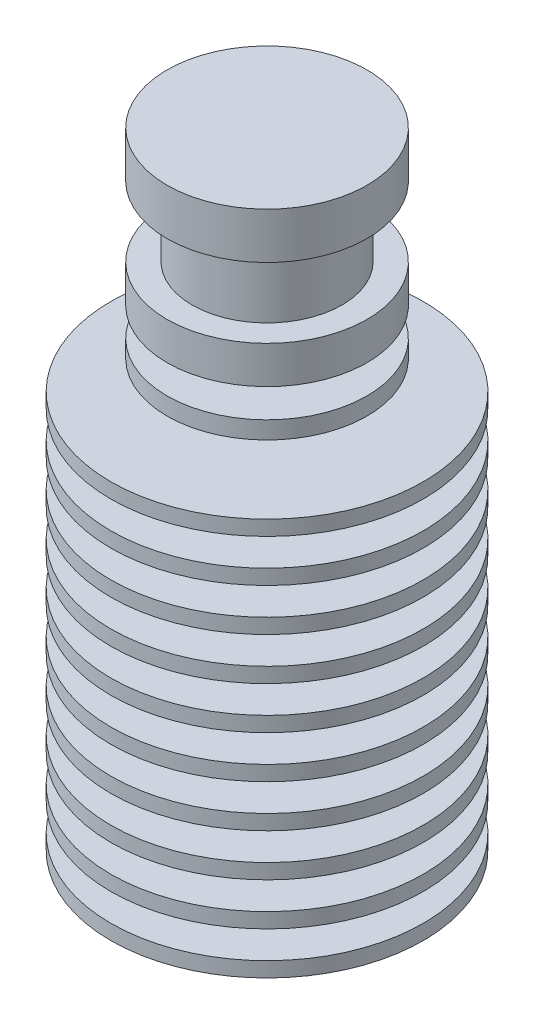
ISO-10303-21;
HEADER;
FILE_DESCRIPTION(('STEP AP214'),'2;1');
FILE_NAME('part.step','',(''),(''),'','','');
FILE_SCHEMA(('AUTOMOTIVE_DESIGN { 1 0 10303 214 1 1 1 1 }'));
ENDSEC;
DATA;
#1=APPLICATION_CONTEXT('core data for automotive mechanical design processes');
#2=APPLICATION_PROTOCOL_DEFINITION('international standard','automotive_design',2000,#1);
#3=PRODUCT_CONTEXT('',#1,'mechanical');
#4=PRODUCT('Part','Part','',(#3));
#5=PRODUCT_RELATED_PRODUCT_CATEGORY('part','',(#4));
#6=PRODUCT_DEFINITION_FORMATION('','',#4);
#7=PRODUCT_DEFINITION_CONTEXT('part definition',#1,'design');
#8=PRODUCT_DEFINITION('design','',#6,#7);
#9=PRODUCT_DEFINITION_SHAPE('','',#8);
#10=(LENGTH_UNIT() NAMED_UNIT(*) SI_UNIT(.MILLI.,.METRE.));
#11=(NAMED_UNIT(*) PLANE_ANGLE_UNIT() SI_UNIT($,.RADIAN.));
#12=(NAMED_UNIT(*) SI_UNIT($,.STERADIAN.) SOLID_ANGLE_UNIT());
#13=UNCERTAINTY_MEASURE_WITH_UNIT(LENGTH_MEASURE(1.E-05),#10,'distance_accuracy_value','');
#14=(GEOMETRIC_REPRESENTATION_CONTEXT(3) GLOBAL_UNCERTAINTY_ASSIGNED_CONTEXT((#13)) GLOBAL_UNIT_ASSIGNED_CONTEXT((#10,
#11,#12)) REPRESENTATION_CONTEXT('',''));
#15=CARTESIAN_POINT('',(0.,0.,0.));
#16=DIRECTION('',(0.,0.,1.));
#17=DIRECTION('',(1.,0.,0.));
#18=AXIS2_PLACEMENT_3D('',#15,#16,#17);
#19=CARTESIAN_POINT('',(12.5,-29.7,0.));
#20=DIRECTION('',(0.,-1.,0.));
#21=DIRECTION('',(0.,0.,-1.));
#22=AXIS2_PLACEMENT_3D('',#19,#20,#21);
#23=PLANE('',#22);
#24=CARTESIAN_POINT('',(0.,-29.7,0.));
#25=DIRECTION('',(0.,1.,0.));
#26=DIRECTION('',(0.,0.,1.));
#27=AXIS2_PLACEMENT_3D('',#24,#25,#26);
#28=CIRCLE('',#27,12.5);
#29=CARTESIAN_POINT('',(0.,-29.7,12.5));
#30=VERTEX_POINT('',#29);
#31=EDGE_CURVE('E84',#30,#30,#28,.T.);
#32=ORIENTED_EDGE('',*,*,#31,.F.);
#33=EDGE_LOOP('',(#32));
#34=FACE_BOUND('',#33,.T.);
#35=CARTESIAN_POINT('',(0.,-29.7,0.));
#36=DIRECTION('',(0.,-1.,0.));
#37=DIRECTION('',(0.,0.,-1.));
#38=AXIS2_PLACEMENT_3D('',#35,#36,#37);
#39=CIRCLE('',#38,6.);
#40=CARTESIAN_POINT('',(0.,-29.7,-6.));
#41=VERTEX_POINT('',#40);
#42=EDGE_CURVE('E51',#41,#41,#39,.T.);
#43=ORIENTED_EDGE('',*,*,#42,.F.);
#44=EDGE_LOOP('',(#43));
#45=FACE_BOUND('',#44,.T.);
#46=ADVANCED_FACE('F30',(#34,#45),#23,.T.);
#47=CARTESIAN_POINT('',(0.,0.,0.));
#48=DIRECTION('',(0.,1.,0.));
#49=DIRECTION('',(0.,0.,1.));
#50=AXIS2_PLACEMENT_3D('',#47,#48,#49);
#51=CYLINDRICAL_SURFACE('',#50,12.5);
#52=CARTESIAN_POINT('',(0.,-22.9,0.));
#53=DIRECTION('',(0.,1.,0.));
#54=DIRECTION('',(0.,0.,1.));
#55=AXIS2_PLACEMENT_3D('',#52,#53,#54);
#56=CIRCLE('',#55,12.5);
#57=CARTESIAN_POINT('',(0.,-22.9,12.5));
#58=VERTEX_POINT('',#57);
#59=EDGE_CURVE('E63',#58,#58,#56,.T.);
#60=ORIENTED_EDGE('',*,*,#59,.T.);
#61=EDGE_LOOP('',(#60));
#62=FACE_BOUND('',#61,.T.);
#63=CARTESIAN_POINT('',(0.,-21.7,0.));
#64=DIRECTION('',(0.,1.,0.));
#65=DIRECTION('',(0.,0.,1.));
#66=AXIS2_PLACEMENT_3D('',#63,#64,#65);
#67=CIRCLE('',#66,12.5);
#68=CARTESIAN_POINT('',(0.,-21.7,12.5));
#69=VERTEX_POINT('',#68);
#70=EDGE_CURVE('E54',#69,#69,#67,.T.);
#71=ORIENTED_EDGE('',*,*,#70,.F.);
#72=EDGE_LOOP('',(#71));
#73=FACE_BOUND('',#72,.T.);
#74=ADVANCED_FACE('F204',(#62,#73),#51,.T.);
#75=CARTESIAN_POINT('',(0.,-26.3,0.));
#76=DIRECTION('',(0.,1.,0.));
#77=DIRECTION('',(0.,0.,1.));
#78=AXIS2_PLACEMENT_3D('',#75,#76,#77);
#79=CIRCLE('',#78,12.5);
#80=CARTESIAN_POINT('',(0.,-26.3,12.5));
#81=VERTEX_POINT('',#80);
#82=EDGE_CURVE('E75',#81,#81,#79,.T.);
#83=ORIENTED_EDGE('',*,*,#82,.T.);
#84=EDGE_LOOP('',(#83));
#85=FACE_BOUND('',#84,.T.);
#86=CARTESIAN_POINT('',(0.,-25.1,0.));
#87=DIRECTION('',(0.,1.,0.));
#88=DIRECTION('',(0.,0.,1.));
#89=AXIS2_PLACEMENT_3D('',#86,#87,#88);
#90=CIRCLE('',#89,12.5);
#91=CARTESIAN_POINT('',(0.,-25.1,12.5));
#92=VERTEX_POINT('',#91);
#93=EDGE_CURVE('E66',#92,#92,#90,.T.);
#94=ORIENTED_EDGE('',*,*,#93,.F.);
#95=EDGE_LOOP('',(#94));
#96=FACE_BOUND('',#95,.T.);
#97=ADVANCED_FACE('F214',(#85,#96),#51,.T.);
#98=ORIENTED_EDGE('',*,*,#31,.T.);
#99=EDGE_LOOP('',(#98));
#100=FACE_BOUND('',#99,.T.);
#101=CARTESIAN_POINT('',(0.,-28.5,0.));
#102=DIRECTION('',(0.,1.,0.));
#103=DIRECTION('',(0.,0.,1.));
#104=AXIS2_PLACEMENT_3D('',#101,#102,#103);
#105=CIRCLE('',#104,12.5);
#106=CARTESIAN_POINT('',(0.,-28.5,12.5));
#107=VERTEX_POINT('',#106);
#108=EDGE_CURVE('E78',#107,#107,#105,.T.);
#109=ORIENTED_EDGE('',*,*,#108,.F.);
#110=EDGE_LOOP('',(#109));
#111=FACE_BOUND('',#110,.T.);
#112=ADVANCED_FACE('F329',(#100,#111),#51,.T.);
#113=CARTESIAN_POINT('',(0.,20.4,0.));
#114=DIRECTION('',(0.,1.,0.));
#115=DIRECTION('',(0.,0.,1.));
#116=AXIS2_PLACEMENT_3D('',#113,#114,#115);
#117=CYLINDRICAL_SURFACE('',#116,4.50000000000001);
#118=CARTESIAN_POINT('',(0.,-28.5,0.));
#119=DIRECTION('',(0.,1.,0.));
#120=DIRECTION('',(0.,0.,1.));
#121=AXIS2_PLACEMENT_3D('',#118,#119,#120);
#122=CIRCLE('',#121,4.50000000000001);
#123=CARTESIAN_POINT('',(0.,-28.5,4.50000000000001));
#124=VERTEX_POINT('',#123);
#125=EDGE_CURVE('E81',#124,#124,#122,.T.);
#126=ORIENTED_EDGE('',*,*,#125,.T.);
#127=EDGE_LOOP('',(#126));
#128=FACE_BOUND('',#127,.T.);
#129=CARTESIAN_POINT('',(0.,-26.3,0.));
#130=DIRECTION('',(0.,1.,0.));
#131=DIRECTION('',(0.,0.,1.));
#132=AXIS2_PLACEMENT_3D('',#129,#130,#131);
#133=CIRCLE('',#132,4.50000000000001);
#134=CARTESIAN_POINT('',(0.,-26.3,4.50000000000001));
#135=VERTEX_POINT('',#134);
#136=EDGE_CURVE('E72',#135,#135,#133,.T.);
#137=ORIENTED_EDGE('',*,*,#136,.F.);
#138=EDGE_LOOP('',(#137));
#139=FACE_BOUND('',#138,.T.);
#140=ADVANCED_FACE('F231',(#128,#139),#117,.T.);
#141=CARTESIAN_POINT('',(4.50000000000001,-28.5,0.));
#142=DIRECTION('',(0.,1.,0.));
#143=DIRECTION('',(0.,0.,1.));
#144=AXIS2_PLACEMENT_3D('',#141,#142,#143);
#145=PLANE('',#144);
#146=ORIENTED_EDGE('',*,*,#108,.T.);
#147=EDGE_LOOP('',(#146));
#148=FACE_BOUND('',#147,.T.);
#149=ORIENTED_EDGE('',*,*,#125,.F.);
#150=EDGE_LOOP('',(#149));
#151=FACE_BOUND('',#150,.T.);
#152=ADVANCED_FACE('F339',(#148,#151),#145,.T.);
#153=CARTESIAN_POINT('',(12.5,-26.3,0.));
#154=DIRECTION('',(0.,-1.,0.));
#155=DIRECTION('',(0.,0.,-1.));
#156=AXIS2_PLACEMENT_3D('',#153,#154,#155);
#157=PLANE('',#156);
#158=ORIENTED_EDGE('',*,*,#136,.T.);
#159=EDGE_LOOP('',(#158));
#160=FACE_BOUND('',#159,.T.);
#161=ORIENTED_EDGE('',*,*,#82,.F.);
#162=EDGE_LOOP('',(#161));
#163=FACE_BOUND('',#162,.T.);
#164=ADVANCED_FACE('F347',(#160,#163),#157,.T.);
#165=CARTESIAN_POINT('',(0.,23.8,0.));
#166=DIRECTION('',(0.,1.,0.));
#167=DIRECTION('',(0.,0.,1.));
#168=AXIS2_PLACEMENT_3D('',#165,#166,#167);
#169=CYLINDRICAL_SURFACE('',#168,4.50000000000001);
#170=CARTESIAN_POINT('',(0.,-25.1,0.));
#171=DIRECTION('',(0.,1.,0.));
#172=DIRECTION('',(0.,0.,1.));
#173=AXIS2_PLACEMENT_3D('',#170,#171,#172);
#174=CIRCLE('',#173,4.50000000000001);
#175=CARTESIAN_POINT('',(0.,-25.1,4.50000000000001));
#176=VERTEX_POINT('',#175);
#177=EDGE_CURVE('E69',#176,#176,#174,.T.);
#178=ORIENTED_EDGE('',*,*,#177,.T.);
#179=EDGE_LOOP('',(#178));
#180=FACE_BOUND('',#179,.T.);
#181=CARTESIAN_POINT('',(0.,-22.9,0.));
#182=DIRECTION('',(0.,1.,0.));
#183=DIRECTION('',(0.,0.,1.));
#184=AXIS2_PLACEMENT_3D('',#181,#182,#183);
#185=CIRCLE('',#184,4.50000000000001);
#186=CARTESIAN_POINT('',(0.,-22.9,4.50000000000001));
#187=VERTEX_POINT('',#186);
#188=EDGE_CURVE('E60',#187,#187,#185,.T.);
#189=ORIENTED_EDGE('',*,*,#188,.F.);
#190=EDGE_LOOP('',(#189));
#191=FACE_BOUND('',#190,.T.);
#192=ADVANCED_FACE('F354',(#180,#191),#169,.T.);
#193=CARTESIAN_POINT('',(4.50000000000001,-25.1,0.));
#194=DIRECTION('',(0.,1.,0.));
#195=DIRECTION('',(0.,0.,1.));
#196=AXIS2_PLACEMENT_3D('',#193,#194,#195);
#197=PLANE('',#196);
#198=ORIENTED_EDGE('',*,*,#93,.T.);
#199=EDGE_LOOP('',(#198));
#200=FACE_BOUND('',#199,.T.);
#201=ORIENTED_EDGE('',*,*,#177,.F.);
#202=EDGE_LOOP('',(#201));
#203=FACE_BOUND('',#202,.T.);
#204=ADVANCED_FACE('F360',(#200,#203),#197,.T.);
#205=CARTESIAN_POINT('',(12.5,-22.9,0.));
#206=DIRECTION('',(0.,-1.,0.));
#207=DIRECTION('',(0.,0.,-1.));
#208=AXIS2_PLACEMENT_3D('',#205,#206,#207);
#209=PLANE('',#208);
#210=ORIENTED_EDGE('',*,*,#188,.T.);
#211=EDGE_LOOP('',(#210));
#212=FACE_BOUND('',#211,.T.);
#213=ORIENTED_EDGE('',*,*,#59,.F.);
#214=EDGE_LOOP('',(#213));
#215=FACE_BOUND('',#214,.T.);
#216=ADVANCED_FACE('F363',(#212,#215),#209,.T.);
#217=CARTESIAN_POINT('',(0.,27.2,0.));
#218=DIRECTION('',(0.,1.,0.));
#219=DIRECTION('',(0.,0.,1.));
#220=AXIS2_PLACEMENT_3D('',#217,#218,#219);
#221=CYLINDRICAL_SURFACE('',#220,4.50000000000001);
#222=CARTESIAN_POINT('',(0.,-21.7,0.));
#223=DIRECTION('',(0.,1.,0.));
#224=DIRECTION('',(0.,0.,1.));
#225=AXIS2_PLACEMENT_3D('',#222,#223,#224);
#226=CIRCLE('',#225,4.50000000000001);
#227=CARTESIAN_POINT('',(0.,-21.7,4.50000000000001));
#228=VERTEX_POINT('',#227);
#229=EDGE_CURVE('E57',#228,#228,#226,.T.);
#230=ORIENTED_EDGE('',*,*,#229,.T.);
#231=EDGE_LOOP('',(#230));
#232=FACE_BOUND('',#231,.T.);
#233=CARTESIAN_POINT('',(0.,-19.5,0.));
#234=DIRECTION('',(0.,1.,0.));
#235=DIRECTION('',(0.,0.,1.));
#236=AXIS2_PLACEMENT_3D('',#233,#234,#235);
#237=CIRCLE('',#236,4.50000000000001);
#238=CARTESIAN_POINT('',(0.,-19.5,4.50000000000001));
#239=VERTEX_POINT('',#238);
#240=EDGE_CURVE('E47',#239,#239,#237,.T.);
#241=ORIENTED_EDGE('',*,*,#240,.F.);
#242=EDGE_LOOP('',(#241));
#243=FACE_BOUND('',#242,.T.);
#244=ADVANCED_FACE('F374',(#232,#243),#221,.T.);
#245=CARTESIAN_POINT('',(4.50000000000001,-21.7,0.));
#246=DIRECTION('',(0.,1.,0.));
#247=DIRECTION('',(0.,0.,1.));
#248=AXIS2_PLACEMENT_3D('',#245,#246,#247);
#249=PLANE('',#248);
#250=ORIENTED_EDGE('',*,*,#70,.T.);
#251=EDGE_LOOP('',(#250));
#252=FACE_BOUND('',#251,.T.);
#253=ORIENTED_EDGE('',*,*,#229,.F.);
#254=EDGE_LOOP('',(#253));
#255=FACE_BOUND('',#254,.T.);
#256=ADVANCED_FACE('F380',(#252,#255),#249,.T.);
#257=CARTESIAN_POINT('',(12.5,-19.5,0.));
#258=DIRECTION('',(0.,-1.,0.));
#259=DIRECTION('',(0.,0.,-1.));
#260=AXIS2_PLACEMENT_3D('',#257,#258,#259);
#261=PLANE('',#260);
#262=ORIENTED_EDGE('',*,*,#240,.T.);
#263=EDGE_LOOP('',(#262));
#264=FACE_BOUND('',#263,.T.);
#265=CARTESIAN_POINT('',(0.,-19.5,0.));
#266=DIRECTION('',(0.,1.,0.));
#267=DIRECTION('',(0.,0.,1.));
#268=AXIS2_PLACEMENT_3D('',#265,#266,#267);
#269=CIRCLE('',#268,12.5);
#270=CARTESIAN_POINT('',(0.,-19.5,12.5));
#271=VERTEX_POINT('',#270);
#272=EDGE_CURVE('E50',#271,#271,#269,.T.);
#273=ORIENTED_EDGE('',*,*,#272,.F.);
#274=EDGE_LOOP('',(#273));
#275=FACE_BOUND('',#274,.T.);
#276=ADVANCED_FACE('F383',(#264,#275),#261,.T.);
#277=CARTESIAN_POINT('',(0.,0.,0.));
#278=DIRECTION('',(0.,-1.,0.));
#279=DIRECTION('',(0.,0.,-1.));
#280=AXIS2_PLACEMENT_3D('',#277,#278,#279);
#281=PLANE('',#280);
#282=CARTESIAN_POINT('',(0.,0.,0.));
#283=DIRECTION('',(0.,1.,0.));
#284=DIRECTION('',(0.,0.,1.));
#285=AXIS2_PLACEMENT_3D('',#282,#283,#284);
#286=CIRCLE('',#285,8.);
#287=CARTESIAN_POINT('',(0.,0.,8.));
#288=VERTEX_POINT('',#287);
#289=EDGE_CURVE('E34',#288,#288,#286,.T.);
#290=ORIENTED_EDGE('',*,*,#289,.T.);
#291=EDGE_LOOP('',(#290));
#292=FACE_BOUND('',#291,.T.);
#293=ADVANCED_FACE('F32',(#292),#281,.F.);
#294=CARTESIAN_POINT('',(0.,0.,0.));
#295=DIRECTION('',(0.,1.,0.));
#296=DIRECTION('',(0.,0.,1.));
#297=AXIS2_PLACEMENT_3D('',#294,#295,#296);
#298=CYLINDRICAL_SURFACE('',#297,8.);
#299=ORIENTED_EDGE('',*,*,#289,.F.);
#300=EDGE_LOOP('',(#299));
#301=FACE_BOUND('',#300,.T.);
#302=CARTESIAN_POINT('',(0.,-3.7,0.));
#303=DIRECTION('',(0.,1.,0.));
#304=DIRECTION('',(0.,0.,1.));
#305=AXIS2_PLACEMENT_3D('',#302,#303,#304);
#306=CIRCLE('',#305,8.);
#307=CARTESIAN_POINT('',(0.,-3.7,8.));
#308=VERTEX_POINT('',#307);
#309=EDGE_CURVE('E155',#308,#308,#306,.T.);
#310=ORIENTED_EDGE('',*,*,#309,.T.);
#311=EDGE_LOOP('',(#310));
#312=FACE_BOUND('',#311,.T.);
#313=ADVANCED_FACE('F449',(#301,#312),#298,.T.);
#314=CARTESIAN_POINT('',(8.,-3.7,0.));
#315=DIRECTION('',(0.,1.,0.));
#316=DIRECTION('',(0.,0.,1.));
#317=AXIS2_PLACEMENT_3D('',#314,#315,#316);
#318=PLANE('',#317);
#319=ORIENTED_EDGE('',*,*,#309,.F.);
#320=EDGE_LOOP('',(#319));
#321=FACE_BOUND('',#320,.T.);
#322=CARTESIAN_POINT('',(0.,-3.7,0.));
#323=DIRECTION('',(0.,1.,0.));
#324=DIRECTION('',(0.,0.,1.));
#325=AXIS2_PLACEMENT_3D('',#322,#323,#324);
#326=CIRCLE('',#325,6.);
#327=CARTESIAN_POINT('',(0.,-3.7,6.));
#328=VERTEX_POINT('',#327);
#329=EDGE_CURVE('E153',#328,#328,#326,.T.);
#330=ORIENTED_EDGE('',*,*,#329,.T.);
#331=EDGE_LOOP('',(#330));
#332=FACE_BOUND('',#331,.T.);
#333=ADVANCED_FACE('F446',(#321,#332),#318,.F.);
#334=CARTESIAN_POINT('',(0.,0.,0.));
#335=DIRECTION('',(0.,1.,0.));
#336=DIRECTION('',(0.,0.,1.));
#337=AXIS2_PLACEMENT_3D('',#334,#335,#336);
#338=CYLINDRICAL_SURFACE('',#337,6.);
#339=ORIENTED_EDGE('',*,*,#329,.F.);
#340=EDGE_LOOP('',(#339));
#341=FACE_BOUND('',#340,.T.);
#342=CARTESIAN_POINT('',(0.,-9.3,0.));
#343=DIRECTION('',(0.,1.,0.));
#344=DIRECTION('',(0.,0.,1.));
#345=AXIS2_PLACEMENT_3D('',#342,#343,#344);
#346=CIRCLE('',#345,6.);
#347=CARTESIAN_POINT('',(0.,-9.3,6.));
#348=VERTEX_POINT('',#347);
#349=EDGE_CURVE('E150',#348,#348,#346,.T.);
#350=ORIENTED_EDGE('',*,*,#349,.T.);
#351=EDGE_LOOP('',(#350));
#352=FACE_BOUND('',#351,.T.);
#353=ADVANCED_FACE('F442',(#341,#352),#338,.T.);
#354=CARTESIAN_POINT('',(6.,-9.3,0.));
#355=DIRECTION('',(0.,-1.,0.));
#356=DIRECTION('',(0.,0.,-1.));
#357=AXIS2_PLACEMENT_3D('',#354,#355,#356);
#358=PLANE('',#357);
#359=ORIENTED_EDGE('',*,*,#349,.F.);
#360=EDGE_LOOP('',(#359));
#361=FACE_BOUND('',#360,.T.);
#362=CARTESIAN_POINT('',(0.,-9.3,0.));
#363=DIRECTION('',(0.,1.,0.));
#364=DIRECTION('',(0.,0.,1.));
#365=AXIS2_PLACEMENT_3D('',#362,#363,#364);
#366=CIRCLE('',#365,8.);
#367=CARTESIAN_POINT('',(0.,-9.3,8.));
#368=VERTEX_POINT('',#367);
#369=EDGE_CURVE('E147',#368,#368,#366,.T.);
#370=ORIENTED_EDGE('',*,*,#369,.T.);
#371=EDGE_LOOP('',(#370));
#372=FACE_BOUND('',#371,.T.);
#373=ADVANCED_FACE('F438',(#361,#372),#358,.F.);
#374=CARTESIAN_POINT('',(0.,0.,0.));
#375=DIRECTION('',(0.,1.,0.));
#376=DIRECTION('',(0.,0.,1.));
#377=AXIS2_PLACEMENT_3D('',#374,#375,#376);
#378=CYLINDRICAL_SURFACE('',#377,8.);
#379=ORIENTED_EDGE('',*,*,#369,.F.);
#380=EDGE_LOOP('',(#379));
#381=FACE_BOUND('',#380,.T.);
#382=CARTESIAN_POINT('',(0.,-12.3,0.));
#383=DIRECTION('',(0.,1.,0.));
#384=DIRECTION('',(0.,0.,1.));
#385=AXIS2_PLACEMENT_3D('',#382,#383,#384);
#386=CIRCLE('',#385,8.);
#387=CARTESIAN_POINT('',(0.,-12.3,8.));
#388=VERTEX_POINT('',#387);
#389=EDGE_CURVE('E144',#388,#388,#386,.T.);
#390=ORIENTED_EDGE('',*,*,#389,.T.);
#391=EDGE_LOOP('',(#390));
#392=FACE_BOUND('',#391,.T.);
#393=ADVANCED_FACE('F434',(#381,#392),#378,.T.);
#394=CARTESIAN_POINT('',(8.,-12.3,0.));
#395=DIRECTION('',(0.,1.,0.));
#396=DIRECTION('',(0.,0.,1.));
#397=AXIS2_PLACEMENT_3D('',#394,#395,#396);
#398=PLANE('',#397);
#399=ORIENTED_EDGE('',*,*,#389,.F.);
#400=EDGE_LOOP('',(#399));
#401=FACE_BOUND('',#400,.T.);
#402=CARTESIAN_POINT('',(0.,-12.3,0.));
#403=DIRECTION('',(0.,1.,0.));
#404=DIRECTION('',(0.,0.,1.));
#405=AXIS2_PLACEMENT_3D('',#402,#403,#404);
#406=CIRCLE('',#405,4.5);
#407=CARTESIAN_POINT('',(0.,-12.3,4.5));
#408=VERTEX_POINT('',#407);
#409=EDGE_CURVE('E141',#408,#408,#406,.T.);
#410=ORIENTED_EDGE('',*,*,#409,.T.);
#411=EDGE_LOOP('',(#410));
#412=FACE_BOUND('',#411,.T.);
#413=ADVANCED_FACE('F430',(#401,#412),#398,.F.);
#414=CARTESIAN_POINT('',(0.,0.,0.));
#415=DIRECTION('',(0.,1.,0.));
#416=DIRECTION('',(0.,0.,1.));
#417=AXIS2_PLACEMENT_3D('',#414,#415,#416);
#418=CYLINDRICAL_SURFACE('',#417,4.5);
#419=ORIENTED_EDGE('',*,*,#409,.F.);
#420=EDGE_LOOP('',(#419));
#421=FACE_BOUND('',#420,.T.);
#422=CARTESIAN_POINT('',(0.,-14.6,0.));
#423=DIRECTION('',(0.,1.,0.));
#424=DIRECTION('',(0.,0.,1.));
#425=AXIS2_PLACEMENT_3D('',#422,#423,#424);
#426=CIRCLE('',#425,4.5);
#427=CARTESIAN_POINT('',(0.,-14.6,4.5));
#428=VERTEX_POINT('',#427);
#429=EDGE_CURVE('E138',#428,#428,#426,.T.);
#430=ORIENTED_EDGE('',*,*,#429,.T.);
#431=EDGE_LOOP('',(#430));
#432=FACE_BOUND('',#431,.T.);
#433=ADVANCED_FACE('F426',(#421,#432),#418,.T.);
#434=CARTESIAN_POINT('',(4.5,-14.6,0.));
#435=DIRECTION('',(0.,-1.,0.));
#436=DIRECTION('',(0.,0.,-1.));
#437=AXIS2_PLACEMENT_3D('',#434,#435,#436);
#438=PLANE('',#437);
#439=ORIENTED_EDGE('',*,*,#429,.F.);
#440=EDGE_LOOP('',(#439));
#441=FACE_BOUND('',#440,.T.);
#442=CARTESIAN_POINT('',(0.,-14.6,0.));
#443=DIRECTION('',(0.,1.,0.));
#444=DIRECTION('',(0.,0.,1.));
#445=AXIS2_PLACEMENT_3D('',#442,#443,#444);
#446=CIRCLE('',#445,8.);
#447=CARTESIAN_POINT('',(0.,-14.6,8.));
#448=VERTEX_POINT('',#447);
#449=EDGE_CURVE('E135',#448,#448,#446,.T.);
#450=ORIENTED_EDGE('',*,*,#449,.T.);
#451=EDGE_LOOP('',(#450));
#452=FACE_BOUND('',#451,.T.);
#453=ADVANCED_FACE('F422',(#441,#452),#438,.F.);
#454=CARTESIAN_POINT('',(0.,0.,0.));
#455=DIRECTION('',(0.,1.,0.));
#456=DIRECTION('',(0.,0.,1.));
#457=AXIS2_PLACEMENT_3D('',#454,#455,#456);
#458=CYLINDRICAL_SURFACE('',#457,8.);
#459=ORIENTED_EDGE('',*,*,#449,.F.);
#460=EDGE_LOOP('',(#459));
#461=FACE_BOUND('',#460,.T.);
#462=CARTESIAN_POINT('',(0.,-16.,0.));
#463=DIRECTION('',(0.,1.,0.));
#464=DIRECTION('',(0.,0.,1.));
#465=AXIS2_PLACEMENT_3D('',#462,#463,#464);
#466=CIRCLE('',#465,8.);
#467=CARTESIAN_POINT('',(0.,-16.,8.));
#468=VERTEX_POINT('',#467);
#469=EDGE_CURVE('E132',#468,#468,#466,.T.);
#470=ORIENTED_EDGE('',*,*,#469,.T.);
#471=EDGE_LOOP('',(#470));
#472=FACE_BOUND('',#471,.T.);
#473=ADVANCED_FACE('F418',(#461,#472),#458,.T.);
#474=CARTESIAN_POINT('',(8.,-16.,0.));
#475=DIRECTION('',(0.,1.,0.));
#476=DIRECTION('',(0.,0.,1.));
#477=AXIS2_PLACEMENT_3D('',#474,#475,#476);
#478=PLANE('',#477);
#479=ORIENTED_EDGE('',*,*,#469,.F.);
#480=EDGE_LOOP('',(#479));
#481=FACE_BOUND('',#480,.T.);
#482=CARTESIAN_POINT('',(0.,-16.,0.));
#483=DIRECTION('',(0.,1.,0.));
#484=DIRECTION('',(0.,0.,1.));
#485=AXIS2_PLACEMENT_3D('',#482,#483,#484);
#486=CIRCLE('',#485,4.5);
#487=CARTESIAN_POINT('',(0.,-16.,4.5));
#488=VERTEX_POINT('',#487);
#489=EDGE_CURVE('E129',#488,#488,#486,.T.);
#490=ORIENTED_EDGE('',*,*,#489,.T.);
#491=EDGE_LOOP('',(#490));
#492=FACE_BOUND('',#491,.T.);
#493=ADVANCED_FACE('F411',(#481,#492),#478,.F.);
#494=CARTESIAN_POINT('',(0.,0.,0.));
#495=DIRECTION('',(0.,1.,0.));
#496=DIRECTION('',(0.,0.,1.));
#497=AXIS2_PLACEMENT_3D('',#494,#495,#496);
#498=CYLINDRICAL_SURFACE('',#497,4.5);
#499=ORIENTED_EDGE('',*,*,#489,.F.);
#500=EDGE_LOOP('',(#499));
#501=FACE_BOUND('',#500,.T.);
#502=CARTESIAN_POINT('',(0.,-18.3,0.));
#503=DIRECTION('',(0.,1.,0.));
#504=DIRECTION('',(0.,0.,1.));
#505=AXIS2_PLACEMENT_3D('',#502,#503,#504);
#506=CIRCLE('',#505,4.5);
#507=CARTESIAN_POINT('',(0.,-18.3,4.5));
#508=VERTEX_POINT('',#507);
#509=EDGE_CURVE('E126',#508,#508,#506,.T.);
#510=ORIENTED_EDGE('',*,*,#509,.T.);
#511=EDGE_LOOP('',(#510));
#512=FACE_BOUND('',#511,.T.);
#513=ADVANCED_FACE('F404',(#501,#512),#498,.T.);
#514=CARTESIAN_POINT('',(4.5,-18.3,0.));
#515=DIRECTION('',(0.,-1.,0.));
#516=DIRECTION('',(0.,0.,-1.));
#517=AXIS2_PLACEMENT_3D('',#514,#515,#516);
#518=PLANE('',#517);
#519=ORIENTED_EDGE('',*,*,#509,.F.);
#520=EDGE_LOOP('',(#519));
#521=FACE_BOUND('',#520,.T.);
#522=CARTESIAN_POINT('',(0.,-18.3,0.));
#523=DIRECTION('',(0.,1.,0.));
#524=DIRECTION('',(0.,0.,1.));
#525=AXIS2_PLACEMENT_3D('',#522,#523,#524);
#526=CIRCLE('',#525,12.5);
#527=CARTESIAN_POINT('',(0.,-18.3,12.5));
#528=VERTEX_POINT('',#527);
#529=EDGE_CURVE('E123',#528,#528,#526,.T.);
#530=ORIENTED_EDGE('',*,*,#529,.T.);
#531=EDGE_LOOP('',(#530));
#532=FACE_BOUND('',#531,.T.);
#533=ADVANCED_FACE('F397',(#521,#532),#518,.F.);
#534=ORIENTED_EDGE('',*,*,#529,.F.);
#535=EDGE_LOOP('',(#534));
#536=FACE_BOUND('',#535,.T.);
#537=ORIENTED_EDGE('',*,*,#272,.T.);
#538=EDGE_LOOP('',(#537));
#539=FACE_BOUND('',#538,.T.);
#540=ADVANCED_FACE('F216',(#536,#539),#51,.T.);
#541=CARTESIAN_POINT('',(0.,-12.7294372515229,0.));
#542=DIRECTION('',(0.,-1.,0.));
#543=DIRECTION('',(0.,0.,-1.));
#544=AXIS2_PLACEMENT_3D('',#541,#542,#543);
#545=CYLINDRICAL_SURFACE('',#544,6.);
#546=ORIENTED_EDGE('',*,*,#42,.T.);
#547=EDGE_LOOP('',(#546));
#548=FACE_BOUND('',#547,.T.);
#549=CARTESIAN_POINT('',(0.,-31.9,0.));
#550=DIRECTION('',(0.,1.,0.));
#551=DIRECTION('',(0.,0.,1.));
#552=AXIS2_PLACEMENT_3D('',#549,#550,#551);
#553=CIRCLE('',#552,6.);
#554=CARTESIAN_POINT('',(0.,-31.9,6.));
#555=VERTEX_POINT('',#554);
#556=EDGE_CURVE('E756',#555,#555,#553,.T.);
#557=ORIENTED_EDGE('',*,*,#556,.T.);
#558=EDGE_LOOP('',(#557));
#559=FACE_BOUND('',#558,.T.);
#560=ADVANCED_FACE('F209',(#548,#559),#545,.T.);
#561=CARTESIAN_POINT('',(12.5,-50.1,0.));
#562=DIRECTION('',(0.,1.,0.));
#563=DIRECTION('',(0.,0.,1.));
#564=AXIS2_PLACEMENT_3D('',#561,#562,#563);
#565=PLANE('',#564);
#566=CARTESIAN_POINT('',(0.,-50.1,0.));
#567=DIRECTION('',(0.,1.,0.));
#568=DIRECTION('',(0.,0.,1.));
#569=AXIS2_PLACEMENT_3D('',#566,#567,#568);
#570=CIRCLE('',#569,12.5);
#571=CARTESIAN_POINT('',(0.,-50.1,12.5));
#572=VERTEX_POINT('',#571);
#573=EDGE_CURVE('E120',#572,#572,#570,.T.);
#574=ORIENTED_EDGE('',*,*,#573,.F.);
#575=EDGE_LOOP('',(#574));
#576=FACE_BOUND('',#575,.T.);
#577=ADVANCED_FACE('F201',(#576),#565,.F.);
#578=ORIENTED_EDGE('',*,*,#573,.T.);
#579=EDGE_LOOP('',(#578));
#580=FACE_BOUND('',#579,.T.);
#581=CARTESIAN_POINT('',(0.,-48.9,0.));
#582=DIRECTION('',(0.,1.,0.));
#583=DIRECTION('',(0.,0.,1.));
#584=AXIS2_PLACEMENT_3D('',#581,#582,#583);
#585=CIRCLE('',#584,12.5);
#586=CARTESIAN_POINT('',(0.,-48.9,12.5));
#587=VERTEX_POINT('',#586);
#588=EDGE_CURVE('E117',#587,#587,#585,.T.);
#589=ORIENTED_EDGE('',*,*,#588,.F.);
#590=EDGE_LOOP('',(#589));
#591=FACE_BOUND('',#590,.T.);
#592=ADVANCED_FACE('F196',(#580,#591),#51,.T.);
#593=CARTESIAN_POINT('',(4.50000000000001,-48.9,0.));
#594=DIRECTION('',(0.,1.,0.));
#595=DIRECTION('',(0.,0.,1.));
#596=AXIS2_PLACEMENT_3D('',#593,#594,#595);
#597=PLANE('',#596);
#598=CARTESIAN_POINT('',(0.,-48.9,0.));
#599=DIRECTION('',(0.,1.,0.));
#600=DIRECTION('',(0.,0.,1.));
#601=AXIS2_PLACEMENT_3D('',#598,#599,#600);
#602=CIRCLE('',#601,7.5);
#603=CARTESIAN_POINT('',(0.,-48.9,7.5));
#604=VERTEX_POINT('',#603);
#605=EDGE_CURVE('E43',#604,#604,#602,.T.);
#606=ORIENTED_EDGE('',*,*,#605,.F.);
#607=EDGE_LOOP('',(#606));
#608=FACE_BOUND('',#607,.T.);
#609=ORIENTED_EDGE('',*,*,#588,.T.);
#610=EDGE_LOOP('',(#609));
#611=FACE_BOUND('',#610,.T.);
#612=ADVANCED_FACE('F193',(#608,#611),#597,.T.);
#613=CARTESIAN_POINT('',(0.,-10.6867965644036,0.));
#614=DIRECTION('',(0.,-1.,0.));
#615=DIRECTION('',(0.,0.,-1.));
#616=AXIS2_PLACEMENT_3D('',#613,#614,#615);
#617=CYLINDRICAL_SURFACE('',#616,7.5);
#618=ORIENTED_EDGE('',*,*,#605,.T.);
#619=EDGE_LOOP('',(#618));
#620=FACE_BOUND('',#619,.T.);
#621=CARTESIAN_POINT('',(0.,-46.7,0.));
#622=DIRECTION('',(0.,-1.,0.));
#623=DIRECTION('',(0.,0.,-1.));
#624=AXIS2_PLACEMENT_3D('',#621,#622,#623);
#625=CIRCLE('',#624,7.5);
#626=CARTESIAN_POINT('',(0.,-46.7,-7.5));
#627=VERTEX_POINT('',#626);
#628=EDGE_CURVE('E185',#627,#627,#625,.T.);
#629=ORIENTED_EDGE('',*,*,#628,.T.);
#630=EDGE_LOOP('',(#629));
#631=FACE_BOUND('',#630,.T.);
#632=ADVANCED_FACE('F190',(#620,#631),#617,.T.);
#633=CARTESIAN_POINT('',(12.5,-46.7,0.));
#634=DIRECTION('',(0.,-1.,0.));
#635=DIRECTION('',(0.,0.,-1.));
#636=AXIS2_PLACEMENT_3D('',#633,#634,#635);
#637=PLANE('',#636);
#638=ORIENTED_EDGE('',*,*,#628,.F.);
#639=EDGE_LOOP('',(#638));
#640=FACE_BOUND('',#639,.T.);
#641=CARTESIAN_POINT('',(0.,-46.7,0.));
#642=DIRECTION('',(0.,1.,0.));
#643=DIRECTION('',(0.,0.,1.));
#644=AXIS2_PLACEMENT_3D('',#641,#642,#643);
#645=CIRCLE('',#644,12.5);
#646=CARTESIAN_POINT('',(0.,-46.7,12.5));
#647=VERTEX_POINT('',#646);
#648=EDGE_CURVE('E114',#647,#647,#645,.T.);
#649=ORIENTED_EDGE('',*,*,#648,.F.);
#650=EDGE_LOOP('',(#649));
#651=FACE_BOUND('',#650,.T.);
#652=ADVANCED_FACE('F219',(#640,#651),#637,.T.);
#653=ORIENTED_EDGE('',*,*,#648,.T.);
#654=EDGE_LOOP('',(#653));
#655=FACE_BOUND('',#654,.T.);
#656=CARTESIAN_POINT('',(0.,-45.5,0.));
#657=DIRECTION('',(0.,1.,0.));
#658=DIRECTION('',(0.,0.,1.));
#659=AXIS2_PLACEMENT_3D('',#656,#657,#658);
#660=CIRCLE('',#659,12.5);
#661=CARTESIAN_POINT('',(0.,-45.5,12.5));
#662=VERTEX_POINT('',#661);
#663=EDGE_CURVE('E111',#662,#662,#660,.T.);
#664=ORIENTED_EDGE('',*,*,#663,.F.);
#665=EDGE_LOOP('',(#664));
#666=FACE_BOUND('',#665,.T.);
#667=ADVANCED_FACE('F205',(#655,#666),#51,.T.);
#668=CARTESIAN_POINT('',(4.50000000000001,-45.5,0.));
#669=DIRECTION('',(0.,1.,0.));
#670=DIRECTION('',(0.,0.,1.));
#671=AXIS2_PLACEMENT_3D('',#668,#669,#670);
#672=PLANE('',#671);
#673=CARTESIAN_POINT('',(0.,-45.5,0.));
#674=DIRECTION('',(0.,1.,0.));
#675=DIRECTION('',(0.,0.,1.));
#676=AXIS2_PLACEMENT_3D('',#673,#674,#675);
#677=CIRCLE('',#676,7.5);
#678=CARTESIAN_POINT('',(0.,-45.5,7.5));
#679=VERTEX_POINT('',#678);
#680=EDGE_CURVE('E182',#679,#679,#677,.T.);
#681=ORIENTED_EDGE('',*,*,#680,.F.);
#682=EDGE_LOOP('',(#681));
#683=FACE_BOUND('',#682,.T.);
#684=ORIENTED_EDGE('',*,*,#663,.T.);
#685=EDGE_LOOP('',(#684));
#686=FACE_BOUND('',#685,.T.);
#687=ADVANCED_FACE('F218',(#683,#686),#672,.T.);
#688=ORIENTED_EDGE('',*,*,#680,.T.);
#689=EDGE_LOOP('',(#688));
#690=FACE_BOUND('',#689,.T.);
#691=CARTESIAN_POINT('',(0.,-43.3,0.));
#692=DIRECTION('',(0.,-1.,0.));
#693=DIRECTION('',(0.,0.,-1.));
#694=AXIS2_PLACEMENT_3D('',#691,#692,#693);
#695=CIRCLE('',#694,7.5);
#696=CARTESIAN_POINT('',(0.,-43.3,-7.5));
#697=VERTEX_POINT('',#696);
#698=EDGE_CURVE('E179',#697,#697,#695,.T.);
#699=ORIENTED_EDGE('',*,*,#698,.T.);
#700=EDGE_LOOP('',(#699));
#701=FACE_BOUND('',#700,.T.);
#702=ADVANCED_FACE('F270',(#690,#701),#617,.T.);
#703=CARTESIAN_POINT('',(12.5,-43.3,0.));
#704=DIRECTION('',(0.,-1.,0.));
#705=DIRECTION('',(0.,0.,-1.));
#706=AXIS2_PLACEMENT_3D('',#703,#704,#705);
#707=PLANE('',#706);
#708=ORIENTED_EDGE('',*,*,#698,.F.);
#709=EDGE_LOOP('',(#708));
#710=FACE_BOUND('',#709,.T.);
#711=CARTESIAN_POINT('',(0.,-43.3,0.));
#712=DIRECTION('',(0.,1.,0.));
#713=DIRECTION('',(0.,0.,1.));
#714=AXIS2_PLACEMENT_3D('',#711,#712,#713);
#715=CIRCLE('',#714,12.5);
#716=CARTESIAN_POINT('',(0.,-43.3,12.5));
#717=VERTEX_POINT('',#716);
#718=EDGE_CURVE('E108',#717,#717,#715,.T.);
#719=ORIENTED_EDGE('',*,*,#718,.F.);
#720=EDGE_LOOP('',(#719));
#721=FACE_BOUND('',#720,.T.);
#722=ADVANCED_FACE('F267',(#710,#721),#707,.T.);
#723=ORIENTED_EDGE('',*,*,#718,.T.);
#724=EDGE_LOOP('',(#723));
#725=FACE_BOUND('',#724,.T.);
#726=CARTESIAN_POINT('',(0.,-42.1,0.));
#727=DIRECTION('',(0.,1.,0.));
#728=DIRECTION('',(0.,0.,1.));
#729=AXIS2_PLACEMENT_3D('',#726,#727,#728);
#730=CIRCLE('',#729,12.5);
#731=CARTESIAN_POINT('',(0.,-42.1,12.5));
#732=VERTEX_POINT('',#731);
#733=EDGE_CURVE('E105',#732,#732,#730,.T.);
#734=ORIENTED_EDGE('',*,*,#733,.F.);
#735=EDGE_LOOP('',(#734));
#736=FACE_BOUND('',#735,.T.);
#737=ADVANCED_FACE('F221',(#725,#736),#51,.T.);
#738=CARTESIAN_POINT('',(4.50000000000001,-42.1,0.));
#739=DIRECTION('',(0.,1.,0.));
#740=DIRECTION('',(0.,0.,1.));
#741=AXIS2_PLACEMENT_3D('',#738,#739,#740);
#742=PLANE('',#741);
#743=CARTESIAN_POINT('',(0.,-42.1,0.));
#744=DIRECTION('',(0.,1.,0.));
#745=DIRECTION('',(0.,0.,1.));
#746=AXIS2_PLACEMENT_3D('',#743,#744,#745);
#747=CIRCLE('',#746,7.5);
#748=CARTESIAN_POINT('',(0.,-42.1,7.5));
#749=VERTEX_POINT('',#748);
#750=EDGE_CURVE('E10',#749,#749,#747,.T.);
#751=ORIENTED_EDGE('',*,*,#750,.F.);
#752=EDGE_LOOP('',(#751));
#753=FACE_BOUND('',#752,.T.);
#754=ORIENTED_EDGE('',*,*,#733,.T.);
#755=EDGE_LOOP('',(#754));
#756=FACE_BOUND('',#755,.T.);
#757=ADVANCED_FACE('F263',(#753,#756),#742,.T.);
#758=ORIENTED_EDGE('',*,*,#750,.T.);
#759=EDGE_LOOP('',(#758));
#760=FACE_BOUND('',#759,.T.);
#761=CARTESIAN_POINT('',(0.,-39.9,0.));
#762=DIRECTION('',(0.,-1.,0.));
#763=DIRECTION('',(0.,0.,-1.));
#764=AXIS2_PLACEMENT_3D('',#761,#762,#763);
#765=CIRCLE('',#764,7.5);
#766=CARTESIAN_POINT('',(0.,-39.9,-7.5));
#767=VERTEX_POINT('',#766);
#768=EDGE_CURVE('E38',#767,#767,#765,.T.);
#769=ORIENTED_EDGE('',*,*,#768,.T.);
#770=EDGE_LOOP('',(#769));
#771=FACE_BOUND('',#770,.T.);
#772=ADVANCED_FACE('F261',(#760,#771),#617,.T.);
#773=CARTESIAN_POINT('',(12.5,-39.9,0.));
#774=DIRECTION('',(0.,-1.,0.));
#775=DIRECTION('',(0.,0.,-1.));
#776=AXIS2_PLACEMENT_3D('',#773,#774,#775);
#777=PLANE('',#776);
#778=ORIENTED_EDGE('',*,*,#768,.F.);
#779=EDGE_LOOP('',(#778));
#780=FACE_BOUND('',#779,.T.);
#781=CARTESIAN_POINT('',(0.,-39.9,0.));
#782=DIRECTION('',(0.,1.,0.));
#783=DIRECTION('',(0.,0.,1.));
#784=AXIS2_PLACEMENT_3D('',#781,#782,#783);
#785=CIRCLE('',#784,12.5);
#786=CARTESIAN_POINT('',(0.,-39.9,12.5));
#787=VERTEX_POINT('',#786);
#788=EDGE_CURVE('E102',#787,#787,#785,.T.);
#789=ORIENTED_EDGE('',*,*,#788,.F.);
#790=EDGE_LOOP('',(#789));
#791=FACE_BOUND('',#790,.T.);
#792=ADVANCED_FACE('F258',(#780,#791),#777,.T.);
#793=ORIENTED_EDGE('',*,*,#788,.T.);
#794=EDGE_LOOP('',(#793));
#795=FACE_BOUND('',#794,.T.);
#796=CARTESIAN_POINT('',(0.,-38.7,0.));
#797=DIRECTION('',(0.,1.,0.));
#798=DIRECTION('',(0.,0.,1.));
#799=AXIS2_PLACEMENT_3D('',#796,#797,#798);
#800=CIRCLE('',#799,12.5);
#801=CARTESIAN_POINT('',(0.,-38.7,12.5));
#802=VERTEX_POINT('',#801);
#803=EDGE_CURVE('E99',#802,#802,#800,.T.);
#804=ORIENTED_EDGE('',*,*,#803,.F.);
#805=EDGE_LOOP('',(#804));
#806=FACE_BOUND('',#805,.T.);
#807=ADVANCED_FACE('F256',(#795,#806),#51,.T.);
#808=CARTESIAN_POINT('',(4.50000000000001,-38.7,0.));
#809=DIRECTION('',(0.,1.,0.));
#810=DIRECTION('',(0.,0.,1.));
#811=AXIS2_PLACEMENT_3D('',#808,#809,#810);
#812=PLANE('',#811);
#813=CARTESIAN_POINT('',(0.,-38.7,0.));
#814=DIRECTION('',(0.,1.,0.));
#815=DIRECTION('',(0.,0.,1.));
#816=AXIS2_PLACEMENT_3D('',#813,#814,#815);
#817=CIRCLE('',#816,7.5);
#818=CARTESIAN_POINT('',(0.,-38.7,7.5));
#819=VERTEX_POINT('',#818);
#820=EDGE_CURVE('E176',#819,#819,#817,.T.);
#821=ORIENTED_EDGE('',*,*,#820,.F.);
#822=EDGE_LOOP('',(#821));
#823=FACE_BOUND('',#822,.T.);
#824=ORIENTED_EDGE('',*,*,#803,.T.);
#825=EDGE_LOOP('',(#824));
#826=FACE_BOUND('',#825,.T.);
#827=ADVANCED_FACE('F253',(#823,#826),#812,.T.);
#828=ORIENTED_EDGE('',*,*,#820,.T.);
#829=EDGE_LOOP('',(#828));
#830=FACE_BOUND('',#829,.T.);
#831=CARTESIAN_POINT('',(0.,-36.5,0.));
#832=DIRECTION('',(0.,-1.,0.));
#833=DIRECTION('',(0.,0.,-1.));
#834=AXIS2_PLACEMENT_3D('',#831,#832,#833);
#835=CIRCLE('',#834,7.5);
#836=CARTESIAN_POINT('',(0.,-36.5,-7.5));
#837=VERTEX_POINT('',#836);
#838=EDGE_CURVE('E169',#837,#837,#835,.T.);
#839=ORIENTED_EDGE('',*,*,#838,.T.);
#840=EDGE_LOOP('',(#839));
#841=FACE_BOUND('',#840,.T.);
#842=ADVANCED_FACE('F251',(#830,#841),#617,.T.);
#843=CARTESIAN_POINT('',(12.5,-36.5,0.));
#844=DIRECTION('',(0.,-1.,0.));
#845=DIRECTION('',(0.,0.,-1.));
#846=AXIS2_PLACEMENT_3D('',#843,#844,#845);
#847=PLANE('',#846);
#848=ORIENTED_EDGE('',*,*,#838,.F.);
#849=EDGE_LOOP('',(#848));
#850=FACE_BOUND('',#849,.T.);
#851=CARTESIAN_POINT('',(0.,-36.5,0.));
#852=DIRECTION('',(0.,1.,0.));
#853=DIRECTION('',(0.,0.,1.));
#854=AXIS2_PLACEMENT_3D('',#851,#852,#853);
#855=CIRCLE('',#854,12.5);
#856=CARTESIAN_POINT('',(0.,-36.5,12.5));
#857=VERTEX_POINT('',#856);
#858=EDGE_CURVE('E96',#857,#857,#855,.T.);
#859=ORIENTED_EDGE('',*,*,#858,.F.);
#860=EDGE_LOOP('',(#859));
#861=FACE_BOUND('',#860,.T.);
#862=ADVANCED_FACE('F248',(#850,#861),#847,.T.);
#863=ORIENTED_EDGE('',*,*,#858,.T.);
#864=EDGE_LOOP('',(#863));
#865=FACE_BOUND('',#864,.T.);
#866=CARTESIAN_POINT('',(0.,-35.3,0.));
#867=DIRECTION('',(0.,1.,0.));
#868=DIRECTION('',(0.,0.,1.));
#869=AXIS2_PLACEMENT_3D('',#866,#867,#868);
#870=CIRCLE('',#869,12.5);
#871=CARTESIAN_POINT('',(0.,-35.3,12.5));
#872=VERTEX_POINT('',#871);
#873=EDGE_CURVE('E93',#872,#872,#870,.T.);
#874=ORIENTED_EDGE('',*,*,#873,.F.);
#875=EDGE_LOOP('',(#874));
#876=FACE_BOUND('',#875,.T.);
#877=ADVANCED_FACE('F246',(#865,#876),#51,.T.);
#878=CARTESIAN_POINT('',(4.50000000000001,-35.3,0.));
#879=DIRECTION('',(0.,1.,0.));
#880=DIRECTION('',(0.,0.,1.));
#881=AXIS2_PLACEMENT_3D('',#878,#879,#880);
#882=PLANE('',#881);
#883=CARTESIAN_POINT('',(0.,-35.3,0.));
#884=DIRECTION('',(0.,1.,0.));
#885=DIRECTION('',(0.,0.,1.));
#886=AXIS2_PLACEMENT_3D('',#883,#884,#885);
#887=CIRCLE('',#886,7.5);
#888=CARTESIAN_POINT('',(0.,-35.3,7.5));
#889=VERTEX_POINT('',#888);
#890=EDGE_CURVE('E164',#889,#889,#887,.T.);
#891=ORIENTED_EDGE('',*,*,#890,.F.);
#892=EDGE_LOOP('',(#891));
#893=FACE_BOUND('',#892,.T.);
#894=ORIENTED_EDGE('',*,*,#873,.T.);
#895=EDGE_LOOP('',(#894));
#896=FACE_BOUND('',#895,.T.);
#897=ADVANCED_FACE('F243',(#893,#896),#882,.T.);
#898=ORIENTED_EDGE('',*,*,#890,.T.);
#899=EDGE_LOOP('',(#898));
#900=FACE_BOUND('',#899,.T.);
#901=CARTESIAN_POINT('',(0.,-33.1,0.));
#902=DIRECTION('',(0.,-1.,0.));
#903=DIRECTION('',(0.,0.,-1.));
#904=AXIS2_PLACEMENT_3D('',#901,#902,#903);
#905=CIRCLE('',#904,7.5);
#906=CARTESIAN_POINT('',(0.,-33.1,-7.5));
#907=VERTEX_POINT('',#906);
#908=EDGE_CURVE('E160',#907,#907,#905,.T.);
#909=ORIENTED_EDGE('',*,*,#908,.T.);
#910=EDGE_LOOP('',(#909));
#911=FACE_BOUND('',#910,.T.);
#912=ADVANCED_FACE('F241',(#900,#911),#617,.T.);
#913=CARTESIAN_POINT('',(12.5,-33.1,0.));
#914=DIRECTION('',(0.,-1.,0.));
#915=DIRECTION('',(0.,0.,-1.));
#916=AXIS2_PLACEMENT_3D('',#913,#914,#915);
#917=PLANE('',#916);
#918=ORIENTED_EDGE('',*,*,#908,.F.);
#919=EDGE_LOOP('',(#918));
#920=FACE_BOUND('',#919,.T.);
#921=CARTESIAN_POINT('',(0.,-33.1,0.));
#922=DIRECTION('',(0.,1.,0.));
#923=DIRECTION('',(0.,0.,1.));
#924=AXIS2_PLACEMENT_3D('',#921,#922,#923);
#925=CIRCLE('',#924,12.5);
#926=CARTESIAN_POINT('',(0.,-33.1,12.5));
#927=VERTEX_POINT('',#926);
#928=EDGE_CURVE('E90',#927,#927,#925,.T.);
#929=ORIENTED_EDGE('',*,*,#928,.F.);
#930=EDGE_LOOP('',(#929));
#931=FACE_BOUND('',#930,.T.);
#932=ADVANCED_FACE('F238',(#920,#931),#917,.T.);
#933=ORIENTED_EDGE('',*,*,#928,.T.);
#934=EDGE_LOOP('',(#933));
#935=FACE_BOUND('',#934,.T.);
#936=CARTESIAN_POINT('',(0.,-31.9,0.));
#937=DIRECTION('',(0.,1.,0.));
#938=DIRECTION('',(0.,0.,1.));
#939=AXIS2_PLACEMENT_3D('',#936,#937,#938);
#940=CIRCLE('',#939,12.5);
#941=CARTESIAN_POINT('',(0.,-31.9,12.5));
#942=VERTEX_POINT('',#941);
#943=EDGE_CURVE('E87',#942,#942,#940,.T.);
#944=ORIENTED_EDGE('',*,*,#943,.F.);
#945=EDGE_LOOP('',(#944));
#946=FACE_BOUND('',#945,.T.);
#947=ADVANCED_FACE('F236',(#935,#946),#51,.T.);
#948=CARTESIAN_POINT('',(4.50000000000001,-31.9,0.));
#949=DIRECTION('',(0.,1.,0.));
#950=DIRECTION('',(0.,0.,1.));
#951=AXIS2_PLACEMENT_3D('',#948,#949,#950);
#952=PLANE('',#951);
#953=ORIENTED_EDGE('',*,*,#943,.T.);
#954=EDGE_LOOP('',(#953));
#955=FACE_BOUND('',#954,.T.);
#956=ORIENTED_EDGE('',*,*,#556,.F.);
#957=EDGE_LOOP('',(#956));
#958=FACE_BOUND('',#957,.T.);
#959=ADVANCED_FACE('F233',(#955,#958),#952,.T.);
#960=CLOSED_SHELL('',(#46,#74,#97,#112,#140,#152,#164,#192,#204,#216,#244,#256,#276,#293,#313,
#333,#353,#373,#393,#413,#433,#453,#473,#493,#513,#533,#540,#560,#577,#592,#612,#632,#652,#667,
#687,#702,#722,#737,#757,#772,#792,#807,#827,#842,#862,#877,#897,#912,#932,#947,#959));
#961=MANIFOLD_SOLID_BREP('B2',#960);
#962=ADVANCED_BREP_SHAPE_REPRESENTATION('',(#18,#961),#14);
#963=SHAPE_DEFINITION_REPRESENTATION(#9,#962);
ENDSEC;
END-ISO-10303-21;
